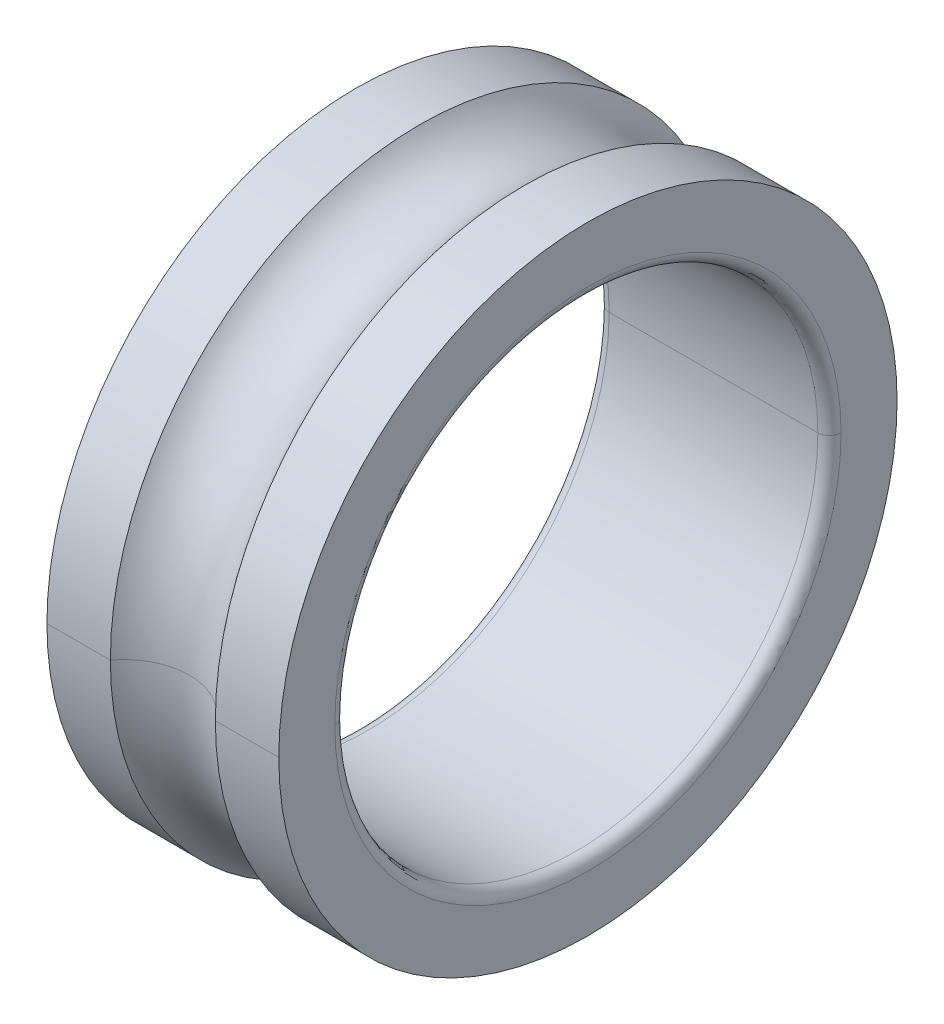
ISO-10303-21;
HEADER;
FILE_DESCRIPTION(('STEP AP214'),'2;1');
FILE_NAME('part.step','',(''),(''),'','','');
FILE_SCHEMA(('AUTOMOTIVE_DESIGN { 1 0 10303 214 1 1 1 1 }'));
ENDSEC;
DATA;
#1=APPLICATION_CONTEXT('core data for automotive mechanical design processes');
#2=APPLICATION_PROTOCOL_DEFINITION('international standard','automotive_design',2000,#1);
#3=PRODUCT_CONTEXT('',#1,'mechanical');
#4=PRODUCT('Part','Part','',(#3));
#5=PRODUCT_RELATED_PRODUCT_CATEGORY('part','',(#4));
#6=PRODUCT_DEFINITION_FORMATION('','',#4);
#7=PRODUCT_DEFINITION_CONTEXT('part definition',#1,'design');
#8=PRODUCT_DEFINITION('design','',#6,#7);
#9=PRODUCT_DEFINITION_SHAPE('','',#8);
#10=(LENGTH_UNIT() NAMED_UNIT(*) SI_UNIT(.MILLI.,.METRE.));
#11=(NAMED_UNIT(*) PLANE_ANGLE_UNIT() SI_UNIT($,.RADIAN.));
#12=(NAMED_UNIT(*) SI_UNIT($,.STERADIAN.) SOLID_ANGLE_UNIT());
#13=UNCERTAINTY_MEASURE_WITH_UNIT(LENGTH_MEASURE(1.E-05),#10,'distance_accuracy_value','');
#14=(GEOMETRIC_REPRESENTATION_CONTEXT(3) GLOBAL_UNCERTAINTY_ASSIGNED_CONTEXT((#13)) GLOBAL_UNIT_ASSIGNED_CONTEXT((#10,
#11,#12)) REPRESENTATION_CONTEXT('',''));
#15=CARTESIAN_POINT('',(0.,0.,0.));
#16=DIRECTION('',(0.,0.,1.));
#17=DIRECTION('',(1.,0.,0.));
#18=AXIS2_PLACEMENT_3D('',#15,#16,#17);
#19=CARTESIAN_POINT('',(0.,16.,0.));
#20=DIRECTION('',(-1.,0.,0.));
#21=DIRECTION('',(0.,0.,1.));
#22=AXIS2_PLACEMENT_3D('',#19,#20,#21);
#23=PLANE('',#22);
#24=CARTESIAN_POINT('',(0.,0.,0.));
#25=DIRECTION('',(1.,0.,0.));
#26=DIRECTION('',(0.,0.,-1.));
#27=AXIS2_PLACEMENT_3D('',#24,#25,#26);
#28=CIRCLE('',#27,13.1);
#29=CARTESIAN_POINT('',(0.,0.,-13.1));
#30=VERTEX_POINT('',#29);
#31=CARTESIAN_POINT('',(-1.28008714739281E-13,0.,13.1));
#32=VERTEX_POINT('',#31);
#33=EDGE_CURVE('E11',#30,#32,#28,.T.);
#34=ORIENTED_EDGE('',*,*,#33,.T.);
#35=CARTESIAN_POINT('',(0.,0.,0.));
#36=DIRECTION('',(1.,0.,0.));
#37=DIRECTION('',(0.,0.,-1.));
#38=AXIS2_PLACEMENT_3D('',#35,#36,#37);
#39=CIRCLE('',#38,13.1);
#40=EDGE_CURVE('E24',#32,#30,#39,.T.);
#41=ORIENTED_EDGE('',*,*,#40,.T.);
#42=EDGE_LOOP('',(#34,#41));
#43=FACE_BOUND('',#42,.T.);
#44=CARTESIAN_POINT('',(0.,0.,0.));
#45=DIRECTION('',(1.,0.,0.));
#46=DIRECTION('',(0.,0.,-1.));
#47=AXIS2_PLACEMENT_3D('',#44,#45,#46);
#48=CIRCLE('',#47,16.);
#49=CARTESIAN_POINT('',(0.,0.,-16.));
#50=VERTEX_POINT('',#49);
#51=CARTESIAN_POINT('',(0.,0.,16.));
#52=VERTEX_POINT('',#51);
#53=EDGE_CURVE('E322',#50,#52,#48,.T.);
#54=ORIENTED_EDGE('',*,*,#53,.F.);
#55=CARTESIAN_POINT('',(0.,0.,0.));
#56=DIRECTION('',(1.,0.,0.));
#57=DIRECTION('',(0.,0.,-1.));
#58=AXIS2_PLACEMENT_3D('',#55,#56,#57);
#59=CIRCLE('',#58,16.);
#60=EDGE_CURVE('E317',#52,#50,#59,.T.);
#61=ORIENTED_EDGE('',*,*,#60,.F.);
#62=EDGE_LOOP('',(#54,#61));
#63=FACE_BOUND('',#62,.T.);
#64=ADVANCED_FACE('F16',(#43,#63),#23,.T.);
#65=CARTESIAN_POINT('',(12.,0.,0.));
#66=DIRECTION('',(-1.,0.,0.));
#67=DIRECTION('',(0.,1.,0.));
#68=AXIS2_PLACEMENT_3D('',#65,#66,#67);
#69=CYLINDRICAL_SURFACE('',#68,16.);
#70=ORIENTED_EDGE('',*,*,#60,.T.);
#71=DIRECTION('',(-1.,0.,0.));
#72=VECTOR('',#71,1.);
#73=CARTESIAN_POINT('',(3.2832920197415,0.,-16.));
#74=LINE('',#73,#72);
#75=CARTESIAN_POINT('',(3.2832920197415,0.,-16.));
#76=VERTEX_POINT('',#75);
#77=EDGE_CURVE('E312',#76,#50,#74,.T.);
#78=ORIENTED_EDGE('',*,*,#77,.F.);
#79=CARTESIAN_POINT('',(3.2832920197415,0.,0.));
#80=DIRECTION('',(1.,0.,0.));
#81=DIRECTION('',(0.,0.,-1.));
#82=AXIS2_PLACEMENT_3D('',#79,#80,#81);
#83=CIRCLE('',#82,16.);
#84=CARTESIAN_POINT('',(3.28329201974153,0.,16.));
#85=VERTEX_POINT('',#84);
#86=EDGE_CURVE('E308',#85,#76,#83,.T.);
#87=ORIENTED_EDGE('',*,*,#86,.F.);
#88=DIRECTION('',(-1.,0.,0.));
#89=VECTOR('',#88,1.);
#90=CARTESIAN_POINT('',(3.2832920197415,0.,16.));
#91=LINE('',#90,#89);
#92=EDGE_CURVE('E303',#85,#52,#91,.T.);
#93=ORIENTED_EDGE('',*,*,#92,.T.);
#94=EDGE_LOOP('',(#70,#78,#87,#93));
#95=FACE_BOUND('',#94,.T.);
#96=ADVANCED_FACE('F337',(#95),#69,.T.);
#97=CARTESIAN_POINT('',(12.,0.,0.));
#98=DIRECTION('',(-1.,0.,0.));
#99=DIRECTION('',(0.,-1.,0.));
#100=AXIS2_PLACEMENT_3D('',#97,#98,#99);
#101=CYLINDRICAL_SURFACE('',#100,16.);
#102=CARTESIAN_POINT('',(3.2832920197415,0.,0.));
#103=DIRECTION('',(1.,0.,0.));
#104=DIRECTION('',(0.,0.,-1.));
#105=AXIS2_PLACEMENT_3D('',#102,#103,#104);
#106=CIRCLE('',#105,16.);
#107=EDGE_CURVE('E301',#76,#85,#106,.T.);
#108=ORIENTED_EDGE('',*,*,#107,.F.);
#109=ORIENTED_EDGE('',*,*,#77,.T.);
#110=ORIENTED_EDGE('',*,*,#53,.T.);
#111=ORIENTED_EDGE('',*,*,#92,.F.);
#112=EDGE_LOOP('',(#108,#109,#110,#111));
#113=FACE_BOUND('',#112,.T.);
#114=ADVANCED_FACE('F334',(#113),#101,.T.);
#115=CARTESIAN_POINT('',(6.,0.,0.));
#116=DIRECTION('',(1.,0.,0.));
#117=DIRECTION('',(0.,-1.,0.));
#118=AXIS2_PLACEMENT_3D('',#115,#116,#117);
#119=TOROIDAL_SURFACE('',#118,18.,3.3735);
#120=ORIENTED_EDGE('',*,*,#107,.T.);
#121=CARTESIAN_POINT('',(8.71670798025848,0.,16.));
#122=CARTESIAN_POINT('',(8.67770165658211,0.,15.947011619319));
#123=CARTESIAN_POINT('',(8.63714154736648,0.,15.8951674101163));
#124=CARTESIAN_POINT('',(8.55306057533481,0.,15.7939381437731));
#125=CARTESIAN_POINT('',(8.50953971251877,0.,15.7445530866324));
#126=CARTESIAN_POINT('',(8.4196840507644,0.,15.6484129335184));
#127=CARTESIAN_POINT('',(8.37334925182607,0.,15.6016578375451));
#128=CARTESIAN_POINT('',(8.27802488191192,0.,15.5109371589799));
#129=CARTESIAN_POINT('',(8.2290353109361,0.,15.4669715763881));
#130=CARTESIAN_POINT('',(8.1285689199559,0.,15.3819805334335));
#131=CARTESIAN_POINT('',(8.0770920999515,0.,15.3409550730707));
#132=CARTESIAN_POINT('',(7.97182744199089,0.,15.2619846583315));
#133=CARTESIAN_POINT('',(7.91803960403466,0.,15.2240397039551));
#134=CARTESIAN_POINT('',(7.80833699893837,0.,15.1513601846756));
#135=CARTESIAN_POINT('',(7.7524222317983,0.,15.1166256197726));
#136=CARTESIAN_POINT('',(7.63865715094668,0.,15.0504857630908));
#137=CARTESIAN_POINT('',(7.58080683723512,0.,15.019080471312));
#138=CARTESIAN_POINT('',(7.46336866690392,0.,14.9597066525309));
#139=CARTESIAN_POINT('',(7.40378081028427,0.,14.9317381255285));
#140=CARTESIAN_POINT('',(7.28307150589893,0.,14.8793335640916));
#141=CARTESIAN_POINT('',(7.22195005813325,0.,14.8548975296572));
#142=CARTESIAN_POINT('',(7.09838277197603,0.,14.8096415906975));
#143=CARTESIAN_POINT('',(7.03593693358449,0.,14.7888216861723));
#144=CARTESIAN_POINT('',(6.90993459976395,0.,14.7508692673731));
#145=CARTESIAN_POINT('',(6.84637810433495,0.,14.7337367530991));
#146=CARTESIAN_POINT('',(6.71837199145802,0.,14.7032177543178));
#147=CARTESIAN_POINT('',(6.65392237401007,0.,14.6898312698105));
#148=CARTESIAN_POINT('',(6.52435060901055,0.,14.6668501485254));
#149=CARTESIAN_POINT('',(6.45922846145897,0.,14.6572555117477));
#150=CARTESIAN_POINT('',(6.32853453003707,0.,14.6418909255165));
#151=CARTESIAN_POINT('',(6.26296274616674,0.,14.636120976063));
#152=CARTESIAN_POINT('',(6.13159397486428,0.,14.6284255133047));
#153=CARTESIAN_POINT('',(6.06579698743214,0.,14.6265));
#154=CARTESIAN_POINT('',(5.93420301256787,0.,14.6265));
#155=CARTESIAN_POINT('',(5.86840602513574,0.,14.6284255133047));
#156=CARTESIAN_POINT('',(5.73703725383328,0.,14.636120976063));
#157=CARTESIAN_POINT('',(5.67146546996295,0.,14.6418909255165));
#158=CARTESIAN_POINT('',(5.54077153854104,0.,14.6572555117477));
#159=CARTESIAN_POINT('',(5.47564939098946,0.,14.6668501485254));
#160=CARTESIAN_POINT('',(5.34607762598994,0.,14.6898312698105));
#161=CARTESIAN_POINT('',(5.281628008542,0.,14.7032177543178));
#162=CARTESIAN_POINT('',(5.15362189566506,0.,14.7337367530991));
#163=CARTESIAN_POINT('',(5.09006540023606,0.,14.7508692673731));
#164=CARTESIAN_POINT('',(4.96406306641552,0.,14.7888216861723));
#165=CARTESIAN_POINT('',(4.90161722802398,0.,14.8096415906975));
#166=CARTESIAN_POINT('',(4.77804994186676,0.,14.8548975296572));
#167=CARTESIAN_POINT('',(4.71692849410108,0.,14.8793335640916));
#168=CARTESIAN_POINT('',(4.59621918971575,0.,14.9317381255285));
#169=CARTESIAN_POINT('',(4.5366313330961,0.,14.9597066525309));
#170=CARTESIAN_POINT('',(4.41919316276489,0.,15.019080471312));
#171=CARTESIAN_POINT('',(4.36134284905333,0.,15.0504857630908));
#172=CARTESIAN_POINT('',(4.24757776820171,0.,15.1166256197726));
#173=CARTESIAN_POINT('',(4.19166300106164,0.,15.1513601846756));
#174=CARTESIAN_POINT('',(4.08196039596535,0.,15.2240397039551));
#175=CARTESIAN_POINT('',(4.02817255800912,0.,15.2619846583315));
#176=CARTESIAN_POINT('',(3.92290790004851,0.,15.3409550730707));
#177=CARTESIAN_POINT('',(3.87143108004412,0.,15.3819805334335));
#178=CARTESIAN_POINT('',(3.7709646890639,0.,15.466971576388));
#179=CARTESIAN_POINT('',(3.72197511808809,0.,15.5109371589799));
#180=CARTESIAN_POINT('',(3.62665074817394,0.,15.601657837545));
#181=CARTESIAN_POINT('',(3.58031594923561,0.,15.6484129335184));
#182=CARTESIAN_POINT('',(3.49046028748124,0.,15.7445530866324));
#183=CARTESIAN_POINT('',(3.4469394246652,0.,15.7939381437731));
#184=CARTESIAN_POINT('',(3.36285845263353,0.,15.8951674101163));
#185=CARTESIAN_POINT('',(3.3222983434179,0.,15.947011619319));
#186=CARTESIAN_POINT('',(3.28329201974153,0.,16.));
#187=B_SPLINE_CURVE_WITH_KNOTS('',3,(#121,#122,#123,#124,#125,#126,#127,#128,#129,#130,#131,
#132,#133,#134,#135,#136,#137,#138,#139,#140,#141,#142,#143,#144,#145,#146,#147,#148,#149,#150,
#151,#152,#153,#154,#155,#156,#157,#158,#159,#160,#161,#162,#163,#164,#165,#166,#167,#168,#169,
#170,#171,#172,#173,#174,#175,#176,#177,#178,#179,#180,#181,#182,#183,#184,#185,#186),
.UNSPECIFIED.,.F.,.F.,(4,2,2,2,2,2,2,2,2,2,2,2,2,2,2,2,2,2,2,2,2,2,2,2,2,2,2,2,2,2,2,2,4),(0.,
0.197362817880837,0.394725635761669,0.592088453642502,0.789451271523337,0.986814089404171,
1.184176907285,1.38153972516584,1.57890254304667,1.77626536092751,1.97362817880834,
2.17099099668917,2.36835381457001,2.56571663245084,2.76307945033167,2.96044226821251,
3.15780508609334,3.35516790397418,3.55253072185501,3.74989353973584,3.94725635761668,
4.14461917549751,4.34198199337834,4.53934481125918,4.73670762914001,4.93407044702085,
5.13143326490168,5.32879608278251,5.52615890066335,5.72352171854418,5.92088453642501,
6.11824735430585,6.31561017218668),.UNSPECIFIED.);
#188=CARTESIAN_POINT('',(8.7167079802585,0.,16.));
#189=VERTEX_POINT('',#188);
#190=EDGE_CURVE('E269',#189,#85,#187,.T.);
#191=ORIENTED_EDGE('',*,*,#190,.F.);
#192=CARTESIAN_POINT('',(8.7167079802585,0.,0.));
#193=DIRECTION('',(1.,0.,0.));
#194=DIRECTION('',(0.,0.,-1.));
#195=AXIS2_PLACEMENT_3D('',#192,#193,#194);
#196=CIRCLE('',#195,16.);
#197=CARTESIAN_POINT('',(8.7167079802585,0.,-16.));
#198=VERTEX_POINT('',#197);
#199=EDGE_CURVE('E287',#198,#189,#196,.T.);
#200=ORIENTED_EDGE('',*,*,#199,.F.);
#201=CARTESIAN_POINT('',(8.71670798025847,0.,-16.));
#202=CARTESIAN_POINT('',(8.67770165658211,0.,-15.947011619319));
#203=CARTESIAN_POINT('',(8.63714154736648,0.,-15.8951674101163));
#204=CARTESIAN_POINT('',(8.55306057533481,0.,-15.7939381437731));
#205=CARTESIAN_POINT('',(8.50953971251877,0.,-15.7445530866324));
#206=CARTESIAN_POINT('',(8.4196840507644,0.,-15.6484129335184));
#207=CARTESIAN_POINT('',(8.37334925182607,0.,-15.6016578375451));
#208=CARTESIAN_POINT('',(8.27802488191192,0.,-15.5109371589799));
#209=CARTESIAN_POINT('',(8.2290353109361,0.,-15.4669715763881));
#210=CARTESIAN_POINT('',(8.12856891995589,0.,-15.3819805334335));
#211=CARTESIAN_POINT('',(8.0770920999515,0.,-15.3409550730707));
#212=CARTESIAN_POINT('',(7.97182744199088,0.,-15.2619846583315));
#213=CARTESIAN_POINT('',(7.91803960403466,0.,-15.2240397039551));
#214=CARTESIAN_POINT('',(7.80833699893837,0.,-15.1513601846756));
#215=CARTESIAN_POINT('',(7.7524222317983,0.,-15.1166256197726));
#216=CARTESIAN_POINT('',(7.63865715094668,0.,-15.0504857630908));
#217=CARTESIAN_POINT('',(7.58080683723512,0.,-15.019080471312));
#218=CARTESIAN_POINT('',(7.46336866690391,0.,-14.9597066525309));
#219=CARTESIAN_POINT('',(7.40378081028426,0.,-14.9317381255285));
#220=CARTESIAN_POINT('',(7.28307150589893,0.,-14.8793335640916));
#221=CARTESIAN_POINT('',(7.22195005813325,0.,-14.8548975296572));
#222=CARTESIAN_POINT('',(7.09838277197603,0.,-14.8096415906975));
#223=CARTESIAN_POINT('',(7.03593693358448,0.,-14.7888216861723));
#224=CARTESIAN_POINT('',(6.90993459976395,0.,-14.7508692673731));
#225=CARTESIAN_POINT('',(6.84637810433495,0.,-14.7337367530991));
#226=CARTESIAN_POINT('',(6.71837199145801,0.,-14.7032177543178));
#227=CARTESIAN_POINT('',(6.65392237401007,0.,-14.6898312698105));
#228=CARTESIAN_POINT('',(6.52435060901055,0.,-14.6668501485254));
#229=CARTESIAN_POINT('',(6.45922846145897,0.,-14.6572555117477));
#230=CARTESIAN_POINT('',(6.32853453003706,0.,-14.6418909255165));
#231=CARTESIAN_POINT('',(6.26296274616673,0.,-14.636120976063));
#232=CARTESIAN_POINT('',(6.13159397486427,0.,-14.6284255133047));
#233=CARTESIAN_POINT('',(6.06579698743214,0.,-14.6265));
#234=CARTESIAN_POINT('',(5.93420301256787,0.,-14.6265));
#235=CARTESIAN_POINT('',(5.86840602513573,0.,-14.6284255133047));
#236=CARTESIAN_POINT('',(5.73703725383327,0.,-14.636120976063));
#237=CARTESIAN_POINT('',(5.67146546996294,0.,-14.6418909255165));
#238=CARTESIAN_POINT('',(5.54077153854104,0.,-14.6572555117477));
#239=CARTESIAN_POINT('',(5.47564939098946,0.,-14.6668501485254));
#240=CARTESIAN_POINT('',(5.34607762598994,0.,-14.6898312698105));
#241=CARTESIAN_POINT('',(5.28162800854199,0.,-14.7032177543178));
#242=CARTESIAN_POINT('',(5.15362189566506,0.,-14.7337367530991));
#243=CARTESIAN_POINT('',(5.09006540023606,0.,-14.7508692673731));
#244=CARTESIAN_POINT('',(4.96406306641552,0.,-14.7888216861723));
#245=CARTESIAN_POINT('',(4.90161722802398,0.,-14.8096415906975));
#246=CARTESIAN_POINT('',(4.77804994186676,0.,-14.8548975296571));
#247=CARTESIAN_POINT('',(4.71692849410108,0.,-14.8793335640916));
#248=CARTESIAN_POINT('',(4.59621918971574,0.,-14.9317381255285));
#249=CARTESIAN_POINT('',(4.53663133309609,0.,-14.9597066525309));
#250=CARTESIAN_POINT('',(4.41919316276489,0.,-15.019080471312));
#251=CARTESIAN_POINT('',(4.36134284905333,0.,-15.0504857630908));
#252=CARTESIAN_POINT('',(4.24757776820171,0.,-15.1166256197726));
#253=CARTESIAN_POINT('',(4.19166300106164,0.,-15.1513601846756));
#254=CARTESIAN_POINT('',(4.08196039596535,0.,-15.2240397039551));
#255=CARTESIAN_POINT('',(4.02817255800912,0.,-15.2619846583315));
#256=CARTESIAN_POINT('',(3.9229079000485,0.,-15.3409550730707));
#257=CARTESIAN_POINT('',(3.87143108004411,0.,-15.3819805334335));
#258=CARTESIAN_POINT('',(3.7709646890639,0.,-15.466971576388));
#259=CARTESIAN_POINT('',(3.72197511808808,0.,-15.5109371589799));
#260=CARTESIAN_POINT('',(3.62665074817394,0.,-15.6016578375451));
#261=CARTESIAN_POINT('',(3.5803159492356,0.,-15.6484129335184));
#262=CARTESIAN_POINT('',(3.49046028748123,0.,-15.7445530866324));
#263=CARTESIAN_POINT('',(3.4469394246652,0.,-15.7939381437731));
#264=CARTESIAN_POINT('',(3.36285845263353,0.,-15.8951674101163));
#265=CARTESIAN_POINT('',(3.3222983434179,0.,-15.947011619319));
#266=CARTESIAN_POINT('',(3.28329201974153,0.,-16.));
#267=B_SPLINE_CURVE_WITH_KNOTS('',3,(#201,#202,#203,#204,#205,#206,#207,#208,#209,#210,#211,
#212,#213,#214,#215,#216,#217,#218,#219,#220,#221,#222,#223,#224,#225,#226,#227,#228,#229,#230,
#231,#232,#233,#234,#235,#236,#237,#238,#239,#240,#241,#242,#243,#244,#245,#246,#247,#248,#249,
#250,#251,#252,#253,#254,#255,#256,#257,#258,#259,#260,#261,#262,#263,#264,#265,#266),
.UNSPECIFIED.,.F.,.F.,(4,2,2,2,2,2,2,2,2,2,2,2,2,2,2,2,2,2,2,2,2,2,2,2,2,2,2,2,2,2,2,2,4),(0.,
0.197362817880833,0.394725635761667,0.592088453642502,0.789451271523336,0.986814089404169,
1.184176907285,1.38153972516584,1.57890254304667,1.7762653609275,1.97362817880834,
2.17099099668917,2.36835381457001,2.56571663245084,2.76307945033167,2.96044226821251,
3.15780508609334,3.35516790397418,3.55253072185501,3.74989353973584,3.94725635761668,
4.14461917549751,4.34198199337834,4.53934481125918,4.73670762914001,4.93407044702084,
5.13143326490168,5.32879608278251,5.52615890066335,5.72352171854418,5.92088453642501,
6.11824735430585,6.31561017218668),.UNSPECIFIED.);
#268=EDGE_CURVE('E272',#198,#76,#267,.T.);
#269=ORIENTED_EDGE('',*,*,#268,.T.);
#270=EDGE_LOOP('',(#120,#191,#200,#269));
#271=FACE_BOUND('',#270,.T.);
#272=ADVANCED_FACE('F251',(#271),#119,.F.);
#273=CARTESIAN_POINT('',(6.,0.,0.));
#274=DIRECTION('',(1.,0.,0.));
#275=DIRECTION('',(0.,1.,0.));
#276=AXIS2_PLACEMENT_3D('',#273,#274,#275);
#277=TOROIDAL_SURFACE('',#276,18.,3.3735);
#278=CARTESIAN_POINT('',(8.7167079802585,0.,0.));
#279=DIRECTION('',(1.,0.,0.));
#280=DIRECTION('',(0.,0.,-1.));
#281=AXIS2_PLACEMENT_3D('',#278,#279,#280);
#282=CIRCLE('',#281,16.);
#283=EDGE_CURVE('E231',#189,#198,#282,.T.);
#284=ORIENTED_EDGE('',*,*,#283,.F.);
#285=ORIENTED_EDGE('',*,*,#190,.T.);
#286=ORIENTED_EDGE('',*,*,#86,.T.);
#287=ORIENTED_EDGE('',*,*,#268,.F.);
#288=EDGE_LOOP('',(#284,#285,#286,#287));
#289=FACE_BOUND('',#288,.T.);
#290=ADVANCED_FACE('F240',(#289),#277,.F.);
#291=CARTESIAN_POINT('',(12.,0.,0.));
#292=DIRECTION('',(-1.,0.,0.));
#293=DIRECTION('',(0.,1.,0.));
#294=AXIS2_PLACEMENT_3D('',#291,#292,#293);
#295=CYLINDRICAL_SURFACE('',#294,16.);
#296=ORIENTED_EDGE('',*,*,#283,.T.);
#297=DIRECTION('',(-1.,0.,0.));
#298=VECTOR('',#297,1.);
#299=CARTESIAN_POINT('',(12.,0.,-16.));
#300=LINE('',#299,#298);
#301=CARTESIAN_POINT('',(12.,0.,-16.));
#302=VERTEX_POINT('',#301);
#303=EDGE_CURVE('E226',#302,#198,#300,.T.);
#304=ORIENTED_EDGE('',*,*,#303,.F.);
#305=CARTESIAN_POINT('',(12.,0.,0.));
#306=DIRECTION('',(1.,0.,0.));
#307=DIRECTION('',(0.,0.,-1.));
#308=AXIS2_PLACEMENT_3D('',#305,#306,#307);
#309=CIRCLE('',#308,16.);
#310=CARTESIAN_POINT('',(12.,0.,16.));
#311=VERTEX_POINT('',#310);
#312=EDGE_CURVE('E221',#311,#302,#309,.T.);
#313=ORIENTED_EDGE('',*,*,#312,.F.);
#314=DIRECTION('',(-1.,0.,0.));
#315=VECTOR('',#314,1.);
#316=CARTESIAN_POINT('',(12.,0.,16.));
#317=LINE('',#316,#315);
#318=EDGE_CURVE('E216',#311,#189,#317,.T.);
#319=ORIENTED_EDGE('',*,*,#318,.T.);
#320=EDGE_LOOP('',(#296,#304,#313,#319));
#321=FACE_BOUND('',#320,.T.);
#322=ADVANCED_FACE('F250',(#321),#295,.T.);
#323=CARTESIAN_POINT('',(12.,0.,0.));
#324=DIRECTION('',(-1.,0.,0.));
#325=DIRECTION('',(0.,-1.,0.));
#326=AXIS2_PLACEMENT_3D('',#323,#324,#325);
#327=CYLINDRICAL_SURFACE('',#326,16.);
#328=CARTESIAN_POINT('',(12.,0.,0.));
#329=DIRECTION('',(1.,0.,0.));
#330=DIRECTION('',(0.,0.,-1.));
#331=AXIS2_PLACEMENT_3D('',#328,#329,#330);
#332=CIRCLE('',#331,16.);
#333=EDGE_CURVE('E211',#302,#311,#332,.T.);
#334=ORIENTED_EDGE('',*,*,#333,.F.);
#335=ORIENTED_EDGE('',*,*,#303,.T.);
#336=ORIENTED_EDGE('',*,*,#199,.T.);
#337=ORIENTED_EDGE('',*,*,#318,.F.);
#338=EDGE_LOOP('',(#334,#335,#336,#337));
#339=FACE_BOUND('',#338,.T.);
#340=ADVANCED_FACE('F342',(#339),#327,.T.);
#341=CARTESIAN_POINT('',(12.,13.1,0.));
#342=DIRECTION('',(1.,0.,0.));
#343=DIRECTION('',(0.,0.,-1.));
#344=AXIS2_PLACEMENT_3D('',#341,#342,#343);
#345=PLANE('',#344);
#346=ORIENTED_EDGE('',*,*,#333,.T.);
#347=ORIENTED_EDGE('',*,*,#312,.T.);
#348=EDGE_LOOP('',(#346,#347));
#349=FACE_BOUND('',#348,.T.);
#350=CARTESIAN_POINT('',(12.,0.,0.));
#351=DIRECTION('',(1.,0.,0.));
#352=DIRECTION('',(0.,0.,-1.));
#353=AXIS2_PLACEMENT_3D('',#350,#351,#352);
#354=CIRCLE('',#353,13.1);
#355=CARTESIAN_POINT('',(12.,0.,-13.1));
#356=VERTEX_POINT('',#355);
#357=CARTESIAN_POINT('',(12.0000000000003,0.,13.1));
#358=VERTEX_POINT('',#357);
#359=EDGE_CURVE('E207',#356,#358,#354,.T.);
#360=ORIENTED_EDGE('',*,*,#359,.F.);
#361=CARTESIAN_POINT('',(12.,0.,0.));
#362=DIRECTION('',(1.,0.,0.));
#363=DIRECTION('',(0.,0.,-1.));
#364=AXIS2_PLACEMENT_3D('',#361,#362,#363);
#365=CIRCLE('',#364,13.1);
#366=EDGE_CURVE('E205',#358,#356,#365,.T.);
#367=ORIENTED_EDGE('',*,*,#366,.F.);
#368=EDGE_LOOP('',(#360,#367));
#369=FACE_BOUND('',#368,.T.);
#370=ADVANCED_FACE('F344',(#349,#369),#345,.T.);
#371=CARTESIAN_POINT('',(11.4000000000003,0.,0.));
#372=DIRECTION('',(1.,0.,0.));
#373=DIRECTION('',(0.,1.,0.));
#374=AXIS2_PLACEMENT_3D('',#371,#372,#373);
#375=TOROIDAL_SURFACE('',#374,13.1,0.6);
#376=ORIENTED_EDGE('',*,*,#366,.T.);
#377=CARTESIAN_POINT('',(12.0000000000003,0.,-13.1));
#378=CARTESIAN_POINT('',(12.0000002082536,0.,-13.0901825130435));
#379=CARTESIAN_POINT('',(11.9997590502754,0.,-13.0803650438072));
#380=CARTESIAN_POINT('',(11.9987954971714,0.,-13.0607537469998));
#381=CARTESIAN_POINT('',(11.9980731020456,0.,-13.0509599194287));
#382=CARTESIAN_POINT('',(11.9961485699616,0.,-13.0314195121758));
#383=CARTESIAN_POINT('',(11.9949464330034,0.,-13.0216729324941));
#384=CARTESIAN_POINT('',(11.9920653789549,0.,-13.0022504981594));
#385=CARTESIAN_POINT('',(11.9903864618645,0.,-12.9925746435063));
#386=CARTESIAN_POINT('',(11.9865558746199,0.,-12.9733169700743));
#387=CARTESIAN_POINT('',(11.9844042044657,0.,-12.9637351512953));
#388=CARTESIAN_POINT('',(11.9796332993684,0.,-12.9446886328207));
#389=CARTESIAN_POINT('',(11.9770140644253,0.,-12.935223933125));
#390=CARTESIAN_POINT('',(11.9713143384539,0.,-12.9164344541695));
#391=CARTESIAN_POINT('',(11.9682338474255,0.,-12.9071096749098));
#392=CARTESIAN_POINT('',(11.9616190307946,0.,-12.8886225010195));
#393=CARTESIAN_POINT('',(11.9580847051921,0.,-12.8794601063889));
#394=CARTESIAN_POINT('',(11.950570733822,0.,-12.8613197747728));
#395=CARTESIAN_POINT('',(11.9465910880545,0.,-12.8523418377872));
#396=CARTESIAN_POINT('',(11.9381960636941,0.,-12.8345920500963));
#397=CARTESIAN_POINT('',(11.9337806851012,0.,-12.825820199391));
#398=CARTESIAN_POINT('',(11.9245248321173,0.,-12.8085037164177));
#399=CARTESIAN_POINT('',(11.9196843577263,0.,-12.7999590841496));
#400=CARTESIAN_POINT('',(11.9095899742746,0.,-12.7831176228183));
#401=CARTESIAN_POINT('',(11.9043360652139,0.,-12.7748207937551));
#402=CARTESIAN_POINT('',(11.8934274695496,0.,-12.7584949266212));
#403=CARTESIAN_POINT('',(11.887772782946,0.,-12.7504658885507));
#404=CARTESIAN_POINT('',(11.8760762548312,0.,-12.7346949460582));
#405=CARTESIAN_POINT('',(11.8700344133201,0.,-12.7269530416363));
#406=CARTESIAN_POINT('',(11.8575781307156,0.,-12.7117750173671));
#407=CARTESIAN_POINT('',(11.8511636896223,0.,-12.7043388975197));
#408=CARTESIAN_POINT('',(11.837977660804,0.,-12.6897903566636));
#409=CARTESIAN_POINT('',(11.831206073079,0.,-12.6826779356549));
#410=CARTESIAN_POINT('',(11.8173220643452,0.,-12.6687939269211));
#411=CARTESIAN_POINT('',(11.8102096433365,0.,-12.6620223391961));
#412=CARTESIAN_POINT('',(11.7956611024803,0.,-12.6488363103778));
#413=CARTESIAN_POINT('',(11.788224982633,0.,-12.6424218692845));
#414=CARTESIAN_POINT('',(11.7730469583637,0.,-12.62996558668));
#415=CARTESIAN_POINT('',(11.7653050539418,0.,-12.6239237451689));
#416=CARTESIAN_POINT('',(11.7495341114494,0.,-12.6122272170541));
#417=CARTESIAN_POINT('',(11.7415050733788,0.,-12.6065725304505));
#418=CARTESIAN_POINT('',(11.725179206245,0.,-12.5956639347862));
#419=CARTESIAN_POINT('',(11.7168823771817,0.,-12.5904100257256));
#420=CARTESIAN_POINT('',(11.7000409158504,0.,-12.5803156422739));
#421=CARTESIAN_POINT('',(11.6914962835824,0.,-12.5754751678829));
#422=CARTESIAN_POINT('',(11.674179800609,0.,-12.5662193148989));
#423=CARTESIAN_POINT('',(11.6654079499037,0.,-12.561803936306));
#424=CARTESIAN_POINT('',(11.6476581622128,0.,-12.5534089119457));
#425=CARTESIAN_POINT('',(11.6386802252272,0.,-12.5494292661782));
#426=CARTESIAN_POINT('',(11.6205398936111,0.,-12.5419152948081));
#427=CARTESIAN_POINT('',(11.6113774989806,0.,-12.5383809692056));
#428=CARTESIAN_POINT('',(11.5928903250903,0.,-12.5317661525747));
#429=CARTESIAN_POINT('',(11.5835655458305,0.,-12.5286856615463));
#430=CARTESIAN_POINT('',(11.564776066875,0.,-12.5229859355749));
#431=CARTESIAN_POINT('',(11.5553113671793,0.,-12.5203667006319));
#432=CARTESIAN_POINT('',(11.5362648487047,0.,-12.5155957955346));
#433=CARTESIAN_POINT('',(11.5266830299257,0.,-12.5134441253803));
#434=CARTESIAN_POINT('',(11.5074253564937,0.,-12.5096135381357));
#435=CARTESIAN_POINT('',(11.4977495018406,0.,-12.5079346210454));
#436=CARTESIAN_POINT('',(11.4783270675059,0.,-12.5050535669968));
#437=CARTESIAN_POINT('',(11.4685804878242,0.,-12.5038514300386));
#438=CARTESIAN_POINT('',(11.4490400805713,0.,-12.5019268979547));
#439=CARTESIAN_POINT('',(11.4392462530002,0.,-12.5012045028289));
#440=CARTESIAN_POINT('',(11.4196349561928,0.,-12.5002409497249));
#441=CARTESIAN_POINT('',(11.4098174869565,0.,-12.4999997917467));
#442=CARTESIAN_POINT('',(11.4,0.,-12.5));
#443=B_SPLINE_CURVE_WITH_KNOTS('',3,(#377,#378,#379,#380,#381,#382,#383,#384,#385,#386,#387,
#388,#389,#390,#391,#392,#393,#394,#395,#396,#397,#398,#399,#400,#401,#402,#403,#404,#405,#406,
#407,#408,#409,#410,#411,#412,#413,#414,#415,#416,#417,#418,#419,#420,#421,#422,#423,#424,#425,
#426,#427,#428,#429,#430,#431,#432,#433,#434,#435,#436,#437,#438,#439,#440,#441,#442),
.UNSPECIFIED.,.F.,.F.,(4,2,2,2,2,2,2,2,2,2,2,2,2,2,2,2,2,2,2,2,2,2,2,2,2,2,2,2,2,2,2,2,4),(0.,
0.029449474227504,0.0588989484550082,0.0883484226825129,0.117797896910017,0.147247371137522,
0.176696845365026,0.20614631959253,0.235595793820034,0.265045268047538,0.294494742275042,
0.323944216502546,0.35339369073005,0.382843164957554,0.412292639185058,0.441742113412562,
0.471191587640066,0.500641061867571,0.530090536095075,0.559540010322579,0.588989484550082,
0.618438958777587,0.647888433005091,0.677337907232595,0.7067873814601,0.736236855687603,
0.765686329915107,0.795135804142612,0.824585278370116,0.85403475259762,0.883484226825123,
0.912933701052628,0.942383175280132),.UNSPECIFIED.);
#444=CARTESIAN_POINT('',(11.4,0.,-12.5));
#445=VERTEX_POINT('',#444);
#446=EDGE_CURVE('E176',#356,#445,#443,.T.);
#447=ORIENTED_EDGE('',*,*,#446,.T.);
#448=CARTESIAN_POINT('',(11.4,0.,0.));
#449=DIRECTION('',(1.,0.,0.));
#450=DIRECTION('',(0.,0.,-1.));
#451=AXIS2_PLACEMENT_3D('',#448,#449,#450);
#452=CIRCLE('',#451,12.5);
#453=CARTESIAN_POINT('',(11.4,0.,12.5));
#454=VERTEX_POINT('',#453);
#455=EDGE_CURVE('E94',#454,#445,#452,.T.);
#456=ORIENTED_EDGE('',*,*,#455,.F.);
#457=CARTESIAN_POINT('',(12.0000000000003,0.,13.1));
#458=CARTESIAN_POINT('',(12.0000002082536,0.,13.0901825130435));
#459=CARTESIAN_POINT('',(11.9997590502754,0.,13.0803650438072));
#460=CARTESIAN_POINT('',(11.9987954971714,0.,13.0607537469998));
#461=CARTESIAN_POINT('',(11.9980731020456,0.,13.0509599194287));
#462=CARTESIAN_POINT('',(11.9961485699616,0.,13.0314195121758));
#463=CARTESIAN_POINT('',(11.9949464330034,0.,13.0216729324941));
#464=CARTESIAN_POINT('',(11.9920653789549,0.,13.0022504981594));
#465=CARTESIAN_POINT('',(11.9903864618645,0.,12.9925746435063));
#466=CARTESIAN_POINT('',(11.9865558746199,0.,12.9733169700743));
#467=CARTESIAN_POINT('',(11.9844042044657,0.,12.9637351512953));
#468=CARTESIAN_POINT('',(11.9796332993684,0.,12.9446886328207));
#469=CARTESIAN_POINT('',(11.9770140644253,0.,12.935223933125));
#470=CARTESIAN_POINT('',(11.9713143384539,0.,12.9164344541695));
#471=CARTESIAN_POINT('',(11.9682338474255,0.,12.9071096749098));
#472=CARTESIAN_POINT('',(11.9616190307946,0.,12.8886225010195));
#473=CARTESIAN_POINT('',(11.9580847051921,0.,12.8794601063889));
#474=CARTESIAN_POINT('',(11.950570733822,0.,12.8613197747728));
#475=CARTESIAN_POINT('',(11.9465910880545,0.,12.8523418377872));
#476=CARTESIAN_POINT('',(11.9381960636941,0.,12.8345920500963));
#477=CARTESIAN_POINT('',(11.9337806851012,0.,12.825820199391));
#478=CARTESIAN_POINT('',(11.9245248321173,0.,12.8085037164177));
#479=CARTESIAN_POINT('',(11.9196843577263,0.,12.7999590841496));
#480=CARTESIAN_POINT('',(11.9095899742746,0.,12.7831176228183));
#481=CARTESIAN_POINT('',(11.9043360652139,0.,12.7748207937551));
#482=CARTESIAN_POINT('',(11.8934274695496,0.,12.7584949266212));
#483=CARTESIAN_POINT('',(11.887772782946,0.,12.7504658885507));
#484=CARTESIAN_POINT('',(11.8760762548312,0.,12.7346949460582));
#485=CARTESIAN_POINT('',(11.8700344133201,0.,12.7269530416363));
#486=CARTESIAN_POINT('',(11.8575781307156,0.,12.7117750173671));
#487=CARTESIAN_POINT('',(11.8511636896223,0.,12.7043388975197));
#488=CARTESIAN_POINT('',(11.837977660804,0.,12.6897903566636));
#489=CARTESIAN_POINT('',(11.831206073079,0.,12.6826779356549));
#490=CARTESIAN_POINT('',(11.8173220643452,0.,12.6687939269211));
#491=CARTESIAN_POINT('',(11.8102096433365,0.,12.6620223391961));
#492=CARTESIAN_POINT('',(11.7956611024803,0.,12.6488363103778));
#493=CARTESIAN_POINT('',(11.788224982633,0.,12.6424218692845));
#494=CARTESIAN_POINT('',(11.7730469583637,0.,12.62996558668));
#495=CARTESIAN_POINT('',(11.7653050539418,0.,12.6239237451689));
#496=CARTESIAN_POINT('',(11.7495341114494,0.,12.6122272170541));
#497=CARTESIAN_POINT('',(11.7415050733788,0.,12.6065725304505));
#498=CARTESIAN_POINT('',(11.725179206245,0.,12.5956639347862));
#499=CARTESIAN_POINT('',(11.7168823771817,0.,12.5904100257256));
#500=CARTESIAN_POINT('',(11.7000409158504,0.,12.5803156422739));
#501=CARTESIAN_POINT('',(11.6914962835824,0.,12.5754751678829));
#502=CARTESIAN_POINT('',(11.674179800609,0.,12.5662193148989));
#503=CARTESIAN_POINT('',(11.6654079499037,0.,12.561803936306));
#504=CARTESIAN_POINT('',(11.6476581622128,0.,12.5534089119457));
#505=CARTESIAN_POINT('',(11.6386802252272,0.,12.5494292661782));
#506=CARTESIAN_POINT('',(11.6205398936111,0.,12.5419152948081));
#507=CARTESIAN_POINT('',(11.6113774989806,0.,12.5383809692056));
#508=CARTESIAN_POINT('',(11.5928903250903,0.,12.5317661525747));
#509=CARTESIAN_POINT('',(11.5835655458305,0.,12.5286856615463));
#510=CARTESIAN_POINT('',(11.564776066875,0.,12.5229859355749));
#511=CARTESIAN_POINT('',(11.5553113671793,0.,12.5203667006319));
#512=CARTESIAN_POINT('',(11.5362648487047,0.,12.5155957955346));
#513=CARTESIAN_POINT('',(11.5266830299257,0.,12.5134441253803));
#514=CARTESIAN_POINT('',(11.5074253564937,0.,12.5096135381357));
#515=CARTESIAN_POINT('',(11.4977495018406,0.,12.5079346210454));
#516=CARTESIAN_POINT('',(11.4783270675059,0.,12.5050535669968));
#517=CARTESIAN_POINT('',(11.4685804878242,0.,12.5038514300386));
#518=CARTESIAN_POINT('',(11.4490400805713,0.,12.5019268979547));
#519=CARTESIAN_POINT('',(11.4392462530002,0.,12.5012045028289));
#520=CARTESIAN_POINT('',(11.4196349561928,0.,12.5002409497249));
#521=CARTESIAN_POINT('',(11.4098174869565,0.,12.4999997917467));
#522=CARTESIAN_POINT('',(11.4,0.,12.5));
#523=B_SPLINE_CURVE_WITH_KNOTS('',3,(#457,#458,#459,#460,#461,#462,#463,#464,#465,#466,#467,
#468,#469,#470,#471,#472,#473,#474,#475,#476,#477,#478,#479,#480,#481,#482,#483,#484,#485,#486,
#487,#488,#489,#490,#491,#492,#493,#494,#495,#496,#497,#498,#499,#500,#501,#502,#503,#504,#505,
#506,#507,#508,#509,#510,#511,#512,#513,#514,#515,#516,#517,#518,#519,#520,#521,#522),
.UNSPECIFIED.,.F.,.F.,(4,2,2,2,2,2,2,2,2,2,2,2,2,2,2,2,2,2,2,2,2,2,2,2,2,2,2,2,2,2,2,2,4),(0.,
0.029449474227504,0.0588989484550082,0.0883484226825129,0.117797896910017,0.147247371137522,
0.176696845365026,0.20614631959253,0.235595793820034,0.265045268047538,0.294494742275042,
0.323944216502546,0.35339369073005,0.382843164957555,0.412292639185058,0.441742113412563,
0.471191587640066,0.500641061867571,0.530090536095075,0.55954001032258,0.588989484550083,
0.618438958777587,0.647888433005091,0.677337907232595,0.7067873814601,0.736236855687603,
0.765686329915109,0.795135804142612,0.824585278370116,0.854034752597621,0.883484226825125,
0.912933701052628,0.942383175280134),.UNSPECIFIED.);
#524=EDGE_CURVE('E178',#358,#454,#523,.T.);
#525=ORIENTED_EDGE('',*,*,#524,.F.);
#526=EDGE_LOOP('',(#376,#447,#456,#525));
#527=FACE_BOUND('',#526,.T.);
#528=ADVANCED_FACE('F159',(#527),#375,.T.);
#529=CARTESIAN_POINT('',(11.4000000000003,0.,0.));
#530=DIRECTION('',(1.,0.,0.));
#531=DIRECTION('',(0.,-1.,0.));
#532=AXIS2_PLACEMENT_3D('',#529,#530,#531);
#533=TOROIDAL_SURFACE('',#532,13.1,0.6);
#534=CARTESIAN_POINT('',(11.4,0.,0.));
#535=DIRECTION('',(1.,0.,0.));
#536=DIRECTION('',(0.,0.,-1.));
#537=AXIS2_PLACEMENT_3D('',#534,#535,#536);
#538=CIRCLE('',#537,12.5);
#539=EDGE_CURVE('E141',#445,#454,#538,.T.);
#540=ORIENTED_EDGE('',*,*,#539,.F.);
#541=ORIENTED_EDGE('',*,*,#446,.F.);
#542=ORIENTED_EDGE('',*,*,#359,.T.);
#543=ORIENTED_EDGE('',*,*,#524,.T.);
#544=EDGE_LOOP('',(#540,#541,#542,#543));
#545=FACE_BOUND('',#544,.T.);
#546=ADVANCED_FACE('F150',(#545),#533,.T.);
#547=CARTESIAN_POINT('',(12.,0.,0.));
#548=DIRECTION('',(-1.,0.,0.));
#549=DIRECTION('',(0.,-1.,0.));
#550=AXIS2_PLACEMENT_3D('',#547,#548,#549);
#551=CYLINDRICAL_SURFACE('',#550,12.5);
#552=ORIENTED_EDGE('',*,*,#539,.T.);
#553=DIRECTION('',(-1.,0.,0.));
#554=VECTOR('',#553,1.);
#555=CARTESIAN_POINT('',(11.4,0.,12.5));
#556=LINE('',#555,#554);
#557=CARTESIAN_POINT('',(0.6,0.,12.5));
#558=VERTEX_POINT('',#557);
#559=EDGE_CURVE('E83',#454,#558,#556,.T.);
#560=ORIENTED_EDGE('',*,*,#559,.T.);
#561=CARTESIAN_POINT('',(0.6,0.,0.));
#562=DIRECTION('',(1.,0.,0.));
#563=DIRECTION('',(0.,0.,-1.));
#564=AXIS2_PLACEMENT_3D('',#561,#562,#563);
#565=CIRCLE('',#564,12.5);
#566=CARTESIAN_POINT('',(0.6,0.,-12.5));
#567=VERTEX_POINT('',#566);
#568=EDGE_CURVE('E76',#567,#558,#565,.T.);
#569=ORIENTED_EDGE('',*,*,#568,.F.);
#570=DIRECTION('',(-1.,0.,0.));
#571=VECTOR('',#570,1.);
#572=CARTESIAN_POINT('',(11.4,0.,-12.5));
#573=LINE('',#572,#571);
#574=EDGE_CURVE('E80',#445,#567,#573,.T.);
#575=ORIENTED_EDGE('',*,*,#574,.F.);
#576=EDGE_LOOP('',(#552,#560,#569,#575));
#577=FACE_BOUND('',#576,.T.);
#578=ADVANCED_FACE('F79',(#577),#551,.F.);
#579=CARTESIAN_POINT('',(12.,0.,0.));
#580=DIRECTION('',(-1.,0.,0.));
#581=DIRECTION('',(0.,1.,0.));
#582=AXIS2_PLACEMENT_3D('',#579,#580,#581);
#583=CYLINDRICAL_SURFACE('',#582,12.5);
#584=CARTESIAN_POINT('',(0.6,0.,0.));
#585=DIRECTION('',(1.,0.,0.));
#586=DIRECTION('',(0.,0.,-1.));
#587=AXIS2_PLACEMENT_3D('',#584,#585,#586);
#588=CIRCLE('',#587,12.5);
#589=EDGE_CURVE('E92',#558,#567,#588,.T.);
#590=ORIENTED_EDGE('',*,*,#589,.F.);
#591=ORIENTED_EDGE('',*,*,#559,.F.);
#592=ORIENTED_EDGE('',*,*,#455,.T.);
#593=ORIENTED_EDGE('',*,*,#574,.T.);
#594=EDGE_LOOP('',(#590,#591,#592,#593));
#595=FACE_BOUND('',#594,.T.);
#596=ADVANCED_FACE('F91',(#595),#583,.F.);
#597=CARTESIAN_POINT('',(0.599999999999872,0.,0.));
#598=DIRECTION('',(1.,0.,0.));
#599=DIRECTION('',(0.,1.,0.));
#600=AXIS2_PLACEMENT_3D('',#597,#598,#599);
#601=TOROIDAL_SURFACE('',#600,13.1,0.6);
#602=ORIENTED_EDGE('',*,*,#589,.T.);
#603=CARTESIAN_POINT('',(0.600000000000001,0.,-12.5));
#604=CARTESIAN_POINT('',(0.590182513043466,0.,-12.4999997917467));
#605=CARTESIAN_POINT('',(0.580365043807242,0.,-12.5002409497249));
#606=CARTESIAN_POINT('',(0.56075374699985,0.,-12.5012045028289));
#607=CARTESIAN_POINT('',(0.550959919428681,0.,-12.5019268979547));
#608=CARTESIAN_POINT('',(0.53141951217583,0.,-12.5038514300387));
#609=CARTESIAN_POINT('',(0.521672932494148,0.,-12.5050535669968));
#610=CARTESIAN_POINT('',(0.502250498159393,0.,-12.5079346210454));
#611=CARTESIAN_POINT('',(0.49257464350632,0.,-12.5096135381357));
#612=CARTESIAN_POINT('',(0.473316970074292,0.,-12.5134441253803));
#613=CARTESIAN_POINT('',(0.463735151295336,0.,-12.5155957955346));
#614=CARTESIAN_POINT('',(0.444688632820703,0.,-12.5203667006319));
#615=CARTESIAN_POINT('',(0.435223933125025,0.,-12.5229859355749));
#616=CARTESIAN_POINT('',(0.416434454169566,0.,-12.5286856615463));
#617=CARTESIAN_POINT('',(0.407109674909785,0.,-12.5317661525747));
#618=CARTESIAN_POINT('',(0.388622501019486,0.,-12.5383809692056));
#619=CARTESIAN_POINT('',(0.379460106388968,0.,-12.5419152948082));
#620=CARTESIAN_POINT('',(0.361319774772848,0.,-12.5494292661782));
#621=CARTESIAN_POINT('',(0.352341837787244,0.,-12.5534089119457));
#622=CARTESIAN_POINT('',(0.33459205009633,0.,-12.5618039363061));
#623=CARTESIAN_POINT('',(0.32582019939102,0.,-12.566219314899));
#624=CARTESIAN_POINT('',(0.308503716417684,0.,-12.5754751678829));
#625=CARTESIAN_POINT('',(0.29995908414966,0.,-12.5803156422739));
#626=CARTESIAN_POINT('',(0.283117622818365,0.,-12.5904100257256));
#627=CARTESIAN_POINT('',(0.274820793755095,0.,-12.5956639347863));
#628=CARTESIAN_POINT('',(0.258494926621262,0.,-12.6065725304506));
#629=CARTESIAN_POINT('',(0.250465888550699,0.,-12.6122272170542));
#630=CARTESIAN_POINT('',(0.234694946058249,0.,-12.6239237451689));
#631=CARTESIAN_POINT('',(0.226953041636361,0.,-12.6299655866801));
#632=CARTESIAN_POINT('',(0.211775017367123,0.,-12.6424218692845));
#633=CARTESIAN_POINT('',(0.204338897519773,0.,-12.6488363103778));
#634=CARTESIAN_POINT('',(0.189790356663652,0.,-12.6620223391961));
#635=CARTESIAN_POINT('',(0.18267793565488,0.,-12.6687939269211));
#636=CARTESIAN_POINT('',(0.1687939269211,0.,-12.6826779356549));
#637=CARTESIAN_POINT('',(0.162022339196091,0.,-12.6897903566637));
#638=CARTESIAN_POINT('',(0.148836310377785,0.,-12.7043388975198));
#639=CARTESIAN_POINT('',(0.142421869284487,0.,-12.7117750173671));
#640=CARTESIAN_POINT('',(0.129965586680045,0.,-12.7269530416364));
#641=CARTESIAN_POINT('',(0.123923745168901,0.,-12.7346949460583));
#642=CARTESIAN_POINT('',(0.112227217054133,0.,-12.7504658885507));
#643=CARTESIAN_POINT('',(0.106572530450511,0.,-12.7584949266213));
#644=CARTESIAN_POINT('',(0.0956639347862338,0.,-12.7748207937551));
#645=CARTESIAN_POINT('',(0.0904100257255792,0.,-12.7831176228184));
#646=CARTESIAN_POINT('',(0.0803156422738854,0.,-12.7999590841497));
#647=CARTESIAN_POINT('',(0.0754751678828462,0.,-12.8085037164177));
#648=CARTESIAN_POINT('',(0.0662193148989113,0.,-12.825820199391));
#649=CARTESIAN_POINT('',(0.0618039363060156,0.,-12.8345920500963));
#650=CARTESIAN_POINT('',(0.0534089119456291,0.,-12.8523418377873));
#651=CARTESIAN_POINT('',(0.0494292661781383,0.,-12.8613197747729));
#652=CARTESIAN_POINT('',(0.0419152948080874,0.,-12.879460106389));
#653=CARTESIAN_POINT('',(0.0383809692055274,0.,-12.8886225010195));
#654=CARTESIAN_POINT('',(0.0317661525746118,0.,-12.9071096749098));
#655=CARTESIAN_POINT('',(0.0286856615462563,0.,-12.9164344541696));
#656=CARTESIAN_POINT('',(0.0229859355748521,0.,-12.935223933125));
#657=CARTESIAN_POINT('',(0.0203667006318034,0.,-12.9446886328207));
#658=CARTESIAN_POINT('',(0.0155957955344989,0.,-12.9637351512953));
#659=CARTESIAN_POINT('',(0.013444125380243,0.,-12.9733169700743));
#660=CARTESIAN_POINT('',(0.00961353813563156,0.,-12.9925746435063));
#661=CARTESIAN_POINT('',(0.00793462104527605,0.,-13.0022504981594));
#662=CARTESIAN_POINT('',(0.00505356699673492,0.,-13.0216729324941));
#663=CARTESIAN_POINT('',(0.0038514300385493,0.,-13.0314195121758));
#664=CARTESIAN_POINT('',(0.0019268979545605,0.,-13.0509599194287));
#665=CARTESIAN_POINT('',(0.00120450282875731,0.,-13.0607537469998));
#666=CARTESIAN_POINT('',(0.000240949724780614,0.,-13.0803650438072));
#667=CARTESIAN_POINT('',(-2.0825339289633E-07,0.,-13.0901825130435));
#668=CARTESIAN_POINT('',(-1.2793585635329E-13,0.,-13.1));
#669=B_SPLINE_CURVE_WITH_KNOTS('',3,(#603,#604,#605,#606,#607,#608,#609,#610,#611,#612,#613,
#614,#615,#616,#617,#618,#619,#620,#621,#622,#623,#624,#625,#626,#627,#628,#629,#630,#631,#632,
#633,#634,#635,#636,#637,#638,#639,#640,#641,#642,#643,#644,#645,#646,#647,#648,#649,#650,#651,
#652,#653,#654,#655,#656,#657,#658,#659,#660,#661,#662,#663,#664,#665,#666,#667,#668),
.UNSPECIFIED.,.F.,.F.,(4,2,2,2,2,2,2,2,2,2,2,2,2,2,2,2,2,2,2,2,2,2,2,2,2,2,2,2,2,2,2,2,4),(0.,
0.0294494742274987,0.0588989484549975,0.0883484226824962,0.117797896909995,0.147247371137493,
0.176696845364992,0.206146319592491,0.23559579381999,0.265045268047488,0.294494742274987,
0.323944216502486,0.353393690729984,0.382843164957483,0.412292639184982,0.44174211341248,
0.47119158763998,0.500641061867478,0.530090536094977,0.559540010322476,0.588989484549974,
0.618438958777473,0.647888433004972,0.67733790723247,0.706787381459968,0.736236855687467,
0.765686329914966,0.795135804142465,0.824585278369963,0.854034752597462,0.883484226824961,
0.91293370105246,0.942383175279959),.UNSPECIFIED.);
#670=EDGE_CURVE('E98',#567,#30,#669,.T.);
#671=ORIENTED_EDGE('',*,*,#670,.T.);
#672=ORIENTED_EDGE('',*,*,#40,.F.);
#673=CARTESIAN_POINT('',(0.600000000000001,0.,12.5));
#674=CARTESIAN_POINT('',(0.590182513043466,0.,12.4999997917467));
#675=CARTESIAN_POINT('',(0.580365043807242,0.,12.5002409497249));
#676=CARTESIAN_POINT('',(0.56075374699985,0.,12.5012045028289));
#677=CARTESIAN_POINT('',(0.550959919428681,0.,12.5019268979547));
#678=CARTESIAN_POINT('',(0.53141951217583,0.,12.5038514300387));
#679=CARTESIAN_POINT('',(0.521672932494148,0.,12.5050535669968));
#680=CARTESIAN_POINT('',(0.502250498159393,0.,12.5079346210454));
#681=CARTESIAN_POINT('',(0.49257464350632,0.,12.5096135381357));
#682=CARTESIAN_POINT('',(0.473316970074292,0.,12.5134441253803));
#683=CARTESIAN_POINT('',(0.463735151295336,0.,12.5155957955346));
#684=CARTESIAN_POINT('',(0.444688632820703,0.,12.5203667006319));
#685=CARTESIAN_POINT('',(0.435223933125025,0.,12.5229859355749));
#686=CARTESIAN_POINT('',(0.416434454169566,0.,12.5286856615463));
#687=CARTESIAN_POINT('',(0.407109674909785,0.,12.5317661525747));
#688=CARTESIAN_POINT('',(0.388622501019486,0.,12.5383809692056));
#689=CARTESIAN_POINT('',(0.379460106388968,0.,12.5419152948082));
#690=CARTESIAN_POINT('',(0.361319774772847,0.,12.5494292661782));
#691=CARTESIAN_POINT('',(0.352341837787244,0.,12.5534089119457));
#692=CARTESIAN_POINT('',(0.33459205009633,0.,12.5618039363061));
#693=CARTESIAN_POINT('',(0.325820199391019,0.,12.566219314899));
#694=CARTESIAN_POINT('',(0.308503716417684,0.,12.5754751678829));
#695=CARTESIAN_POINT('',(0.299959084149659,0.,12.5803156422739));
#696=CARTESIAN_POINT('',(0.283117622818365,0.,12.5904100257256));
#697=CARTESIAN_POINT('',(0.274820793755094,0.,12.5956639347863));
#698=CARTESIAN_POINT('',(0.258494926621262,0.,12.6065725304506));
#699=CARTESIAN_POINT('',(0.250465888550699,0.,12.6122272170542));
#700=CARTESIAN_POINT('',(0.234694946058249,0.,12.6239237451689));
#701=CARTESIAN_POINT('',(0.22695304163636,0.,12.6299655866801));
#702=CARTESIAN_POINT('',(0.211775017367122,0.,12.6424218692845));
#703=CARTESIAN_POINT('',(0.204338897519773,0.,12.6488363103778));
#704=CARTESIAN_POINT('',(0.189790356663651,0.,12.6620223391961));
#705=CARTESIAN_POINT('',(0.18267793565488,0.,12.6687939269211));
#706=CARTESIAN_POINT('',(0.1687939269211,0.,12.6826779356549));
#707=CARTESIAN_POINT('',(0.162022339196091,0.,12.6897903566637));
#708=CARTESIAN_POINT('',(0.148836310377784,0.,12.7043388975198));
#709=CARTESIAN_POINT('',(0.142421869284487,0.,12.7117750173671));
#710=CARTESIAN_POINT('',(0.129965586680045,0.,12.7269530416364));
#711=CARTESIAN_POINT('',(0.123923745168901,0.,12.7346949460583));
#712=CARTESIAN_POINT('',(0.112227217054133,0.,12.7504658885507));
#713=CARTESIAN_POINT('',(0.106572530450511,0.,12.7584949266213));
#714=CARTESIAN_POINT('',(0.0956639347862336,0.,12.7748207937551));
#715=CARTESIAN_POINT('',(0.090410025725579,0.,12.7831176228184));
#716=CARTESIAN_POINT('',(0.0803156422738852,0.,12.7999590841497));
#717=CARTESIAN_POINT('',(0.0754751678828461,0.,12.8085037164177));
#718=CARTESIAN_POINT('',(0.066219314898911,0.,12.825820199391));
#719=CARTESIAN_POINT('',(0.0618039363060151,0.,12.8345920500963));
#720=CARTESIAN_POINT('',(0.0534089119456288,0.,12.8523418377873));
#721=CARTESIAN_POINT('',(0.0494292661781383,0.,12.8613197747729));
#722=CARTESIAN_POINT('',(0.0419152948080875,0.,12.879460106389));
#723=CARTESIAN_POINT('',(0.0383809692055271,0.,12.8886225010195));
#724=CARTESIAN_POINT('',(0.0317661525746115,0.,12.9071096749098));
#725=CARTESIAN_POINT('',(0.0286856615462562,0.,12.9164344541696));
#726=CARTESIAN_POINT('',(0.0229859355748521,0.,12.935223933125));
#727=CARTESIAN_POINT('',(0.0203667006318032,0.,12.9446886328207));
#728=CARTESIAN_POINT('',(0.0155957955344985,0.,12.9637351512953));
#729=CARTESIAN_POINT('',(0.0134441253802427,0.,12.9733169700743));
#730=CARTESIAN_POINT('',(0.00961353813563147,0.,12.9925746435063));
#731=CARTESIAN_POINT('',(0.00793462104527602,0.,13.0022504981594));
#732=CARTESIAN_POINT('',(0.00505356699673491,0.,13.0216729324941));
#733=CARTESIAN_POINT('',(0.00385143003854921,0.,13.0314195121758));
#734=CARTESIAN_POINT('',(0.00192689795456032,0.,13.0509599194287));
#735=CARTESIAN_POINT('',(0.00120450282875716,0.,13.0607537469998));
#736=CARTESIAN_POINT('',(0.00024094972478055,0.,13.0803650438072));
#737=CARTESIAN_POINT('',(-2.08253392897546E-07,0.,13.0901825130435));
#738=CARTESIAN_POINT('',(-1.2793585635329E-13,0.,13.1));
#739=B_SPLINE_CURVE_WITH_KNOTS('',3,(#673,#674,#675,#676,#677,#678,#679,#680,#681,#682,#683,
#684,#685,#686,#687,#688,#689,#690,#691,#692,#693,#694,#695,#696,#697,#698,#699,#700,#701,#702,
#703,#704,#705,#706,#707,#708,#709,#710,#711,#712,#713,#714,#715,#716,#717,#718,#719,#720,#721,
#722,#723,#724,#725,#726,#727,#728,#729,#730,#731,#732,#733,#734,#735,#736,#737,#738),
.UNSPECIFIED.,.F.,.F.,(4,2,2,2,2,2,2,2,2,2,2,2,2,2,2,2,2,2,2,2,2,2,2,2,2,2,2,2,2,2,2,2,4),(0.,
0.0294494742274987,0.0588989484549975,0.0883484226824962,0.117797896909995,0.147247371137493,
0.176696845364993,0.206146319592491,0.23559579381999,0.265045268047488,0.294494742274987,
0.323944216502486,0.353393690729984,0.382843164957484,0.412292639184982,0.44174211341248,
0.47119158763998,0.500641061867478,0.530090536094977,0.559540010322476,0.588989484549974,
0.618438958777473,0.647888433004972,0.677337907232471,0.70678738145997,0.736236855687467,
0.765686329914967,0.795135804142466,0.824585278369963,0.854034752597464,0.883484226824961,
0.91293370105246,0.942383175279959),.UNSPECIFIED.);
#740=EDGE_CURVE('E100',#558,#32,#739,.T.);
#741=ORIENTED_EDGE('',*,*,#740,.F.);
#742=EDGE_LOOP('',(#602,#671,#672,#741));
#743=FACE_BOUND('',#742,.T.);
#744=ADVANCED_FACE('F97',(#743),#601,.T.);
#745=CARTESIAN_POINT('',(0.599999999999872,0.,0.));
#746=DIRECTION('',(1.,0.,0.));
#747=DIRECTION('',(0.,-1.,0.));
#748=AXIS2_PLACEMENT_3D('',#745,#746,#747);
#749=TOROIDAL_SURFACE('',#748,13.1,0.6);
#750=ORIENTED_EDGE('',*,*,#33,.F.);
#751=ORIENTED_EDGE('',*,*,#670,.F.);
#752=ORIENTED_EDGE('',*,*,#568,.T.);
#753=ORIENTED_EDGE('',*,*,#740,.T.);
#754=EDGE_LOOP('',(#750,#751,#752,#753));
#755=FACE_BOUND('',#754,.T.);
#756=ADVANCED_FACE('F104',(#755),#749,.T.);
#757=CLOSED_SHELL('',(#64,#96,#114,#272,#290,#322,#340,#370,#528,#546,#578,#596,#744,#756));
#758=MANIFOLD_SOLID_BREP('B1',#757);
#759=ADVANCED_BREP_SHAPE_REPRESENTATION('',(#18,#758),#14);
#760=SHAPE_DEFINITION_REPRESENTATION(#9,#759);
ENDSEC;
END-ISO-10303-21;
